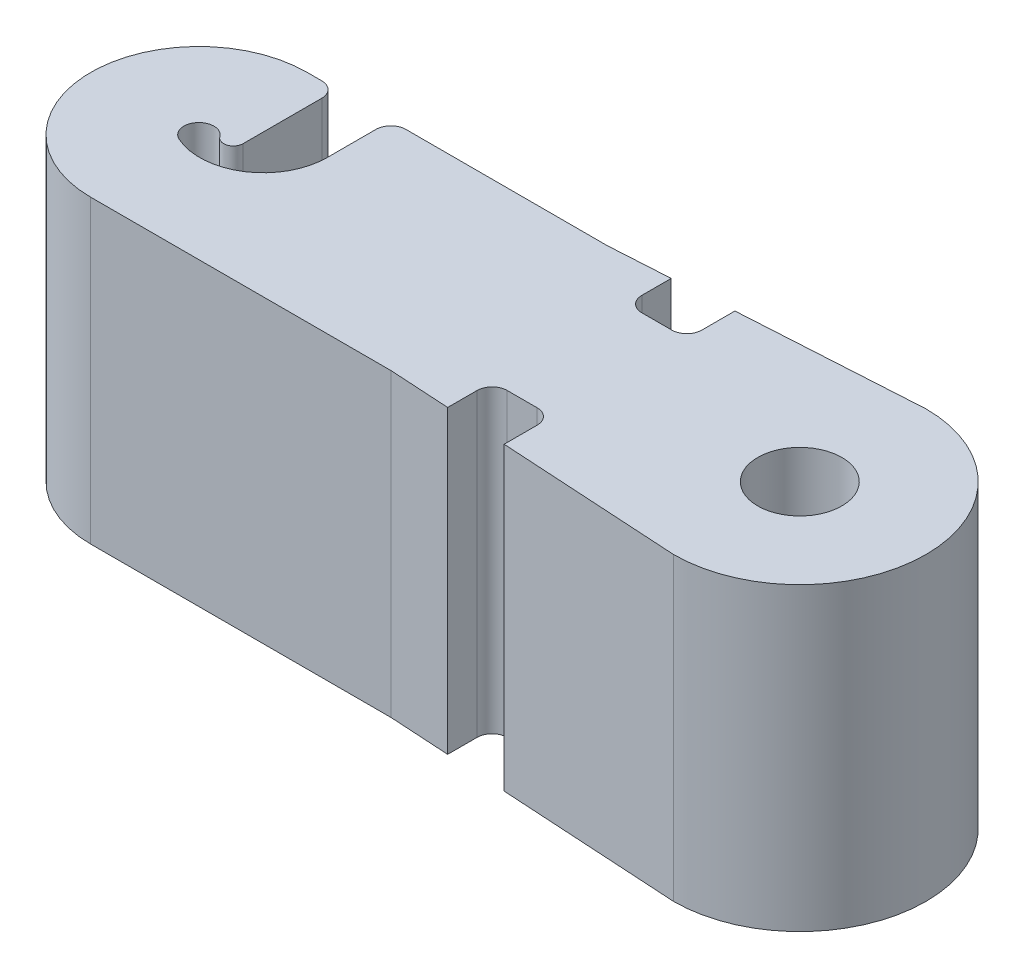
ISO-10303-21;
HEADER;
FILE_DESCRIPTION(('STEP AP214'),'2;1');
FILE_NAME('part.step','',(''),(''),'','','');
FILE_SCHEMA(('AUTOMOTIVE_DESIGN { 1 0 10303 214 1 1 1 1 }'));
ENDSEC;
DATA;
#1=APPLICATION_CONTEXT('core data for automotive mechanical design processes');
#2=APPLICATION_PROTOCOL_DEFINITION('international standard','automotive_design',2000,#1);
#3=PRODUCT_CONTEXT('',#1,'mechanical');
#4=PRODUCT('Part','Part','',(#3));
#5=PRODUCT_RELATED_PRODUCT_CATEGORY('part','',(#4));
#6=PRODUCT_DEFINITION_FORMATION('','',#4);
#7=PRODUCT_DEFINITION_CONTEXT('part definition',#1,'design');
#8=PRODUCT_DEFINITION('design','',#6,#7);
#9=PRODUCT_DEFINITION_SHAPE('','',#8);
#10=(LENGTH_UNIT() NAMED_UNIT(*) SI_UNIT(.MILLI.,.METRE.));
#11=(NAMED_UNIT(*) PLANE_ANGLE_UNIT() SI_UNIT($,.RADIAN.));
#12=(NAMED_UNIT(*) SI_UNIT($,.STERADIAN.) SOLID_ANGLE_UNIT());
#13=UNCERTAINTY_MEASURE_WITH_UNIT(LENGTH_MEASURE(1.E-05),#10,'distance_accuracy_value','');
#14=(GEOMETRIC_REPRESENTATION_CONTEXT(3) GLOBAL_UNCERTAINTY_ASSIGNED_CONTEXT((#13)) GLOBAL_UNIT_ASSIGNED_CONTEXT((#10,
#11,#12)) REPRESENTATION_CONTEXT('',''));
#15=CARTESIAN_POINT('',(0.,0.,0.));
#16=DIRECTION('',(0.,0.,1.));
#17=DIRECTION('',(1.,0.,0.));
#18=AXIS2_PLACEMENT_3D('',#15,#16,#17);
#19=CARTESIAN_POINT('',(-2.50000000000002,2.5,-0.9));
#20=DIRECTION('',(0.,0.,1.));
#21=DIRECTION('',(1.,0.,0.));
#22=AXIS2_PLACEMENT_3D('',#19,#20,#21);
#23=PLANE('',#22);
#24=DIRECTION('',(-1.,0.,0.));
#25=VECTOR('',#24,1.);
#26=CARTESIAN_POINT('',(-2.50000000000002,2.5,-0.9));
#27=LINE('',#26,#25);
#28=CARTESIAN_POINT('',(-4.87715394527874,2.5,-0.9));
#29=VERTEX_POINT('',#28);
#30=CARTESIAN_POINT('',(-5.,2.5,-0.9));
#31=VERTEX_POINT('',#30);
#32=EDGE_CURVE('E295',#29,#31,#27,.T.);
#33=ORIENTED_EDGE('',*,*,#32,.F.);
#34=DIRECTION('',(0.,1.,0.));
#35=VECTOR('',#34,1.);
#36=CARTESIAN_POINT('',(-4.87715394527874,2.5,-0.9));
#37=LINE('',#36,#35);
#38=CARTESIAN_POINT('',(-4.87715394527874,0.,-0.9));
#39=VERTEX_POINT('',#38);
#40=EDGE_CURVE('E368',#29,#39,#37,.F.);
#41=ORIENTED_EDGE('',*,*,#40,.T.);
#42=DIRECTION('',(-1.,0.,0.));
#43=VECTOR('',#42,1.);
#44=CARTESIAN_POINT('',(-2.50000000000002,0.,-0.9));
#45=LINE('',#44,#43);
#46=CARTESIAN_POINT('',(-5.,0.,-0.9));
#47=VERTEX_POINT('',#46);
#48=EDGE_CURVE('E336',#39,#47,#45,.T.);
#49=ORIENTED_EDGE('',*,*,#48,.T.);
#50=DIRECTION('',(0.,-1.,0.));
#51=VECTOR('',#50,1.);
#52=CARTESIAN_POINT('',(-5.,2.5,-0.9));
#53=LINE('',#52,#51);
#54=EDGE_CURVE('E342',#31,#47,#53,.T.);
#55=ORIENTED_EDGE('',*,*,#54,.F.);
#56=EDGE_LOOP('',(#33,#41,#49,#55));
#57=FACE_BOUND('',#56,.T.);
#58=ADVANCED_FACE('F35',(#57),#23,.F.);
#59=CARTESIAN_POINT('',(-2.50000000000002,2.5,-0.9));
#60=DIRECTION('',(-0.0598922907279451,0.,-0.998204845465779));
#61=DIRECTION('',(-0.998204845465779,0.,0.0598922907279451));
#62=AXIS2_PLACEMENT_3D('',#59,#60,#61);
#63=PLANE('',#62);
#64=DIRECTION('',(0.998204845465779,0.,-0.0598922907279451));
#65=VECTOR('',#64,1.);
#66=CARTESIAN_POINT('',(-2.50000000000002,0.,-0.9));
#67=LINE('',#66,#65);
#68=CARTESIAN_POINT('',(-2.50000000000002,0.,-0.9));
#69=VERTEX_POINT('',#68);
#70=CARTESIAN_POINT('',(-2.,0.,-0.93));
#71=VERTEX_POINT('',#70);
#72=EDGE_CURVE('E300',#69,#71,#67,.T.);
#73=ORIENTED_EDGE('',*,*,#72,.F.);
#74=DIRECTION('',(0.,-1.,0.));
#75=VECTOR('',#74,1.);
#76=CARTESIAN_POINT('',(-2.50000000000002,2.5,-0.9));
#77=LINE('',#76,#75);
#78=CARTESIAN_POINT('',(-2.50000000000002,2.5,-0.9));
#79=VERTEX_POINT('',#78);
#80=EDGE_CURVE('E339',#79,#69,#77,.T.);
#81=ORIENTED_EDGE('',*,*,#80,.F.);
#82=DIRECTION('',(0.998204845465779,0.,-0.0598922907279451));
#83=VECTOR('',#82,1.);
#84=CARTESIAN_POINT('',(-2.50000000000002,2.5,-0.9));
#85=LINE('',#84,#83);
#86=CARTESIAN_POINT('',(-2.,2.5,-0.93));
#87=VERTEX_POINT('',#86);
#88=EDGE_CURVE('E258',#79,#87,#85,.T.);
#89=ORIENTED_EDGE('',*,*,#88,.T.);
#90=DIRECTION('',(0.,-1.,0.));
#91=VECTOR('',#90,1.);
#92=CARTESIAN_POINT('',(-2.,2.5,-0.93));
#93=LINE('',#92,#91);
#94=EDGE_CURVE('E299',#87,#71,#93,.T.);
#95=ORIENTED_EDGE('',*,*,#94,.T.);
#96=EDGE_LOOP('',(#73,#81,#89,#95));
#97=FACE_BOUND('',#96,.T.);
#98=ADVANCED_FACE('F427',(#97),#63,.T.);
#99=CARTESIAN_POINT('',(-4.17715394527874,0.,-0.9));
#100=VERTEX_POINT('',#99);
#101=EDGE_CURVE('E262',#69,#100,#45,.T.);
#102=ORIENTED_EDGE('',*,*,#101,.T.);
#103=DIRECTION('',(0.,1.,0.));
#104=VECTOR('',#103,1.);
#105=CARTESIAN_POINT('',(-4.17715394527874,2.5,-0.9));
#106=LINE('',#105,#104);
#107=CARTESIAN_POINT('',(-4.17715394527874,2.5,-0.9));
#108=VERTEX_POINT('',#107);
#109=EDGE_CURVE('E374',#100,#108,#106,.T.);
#110=ORIENTED_EDGE('',*,*,#109,.T.);
#111=EDGE_CURVE('E296',#79,#108,#27,.T.);
#112=ORIENTED_EDGE('',*,*,#111,.F.);
#113=ORIENTED_EDGE('',*,*,#80,.T.);
#114=EDGE_LOOP('',(#102,#110,#112,#113));
#115=FACE_BOUND('',#114,.T.);
#116=ADVANCED_FACE('F431',(#115),#23,.F.);
#117=CARTESIAN_POINT('',(-5.,2.5,0.));
#118=DIRECTION('',(0.,-1.,0.));
#119=DIRECTION('',(0.,0.,-1.));
#120=AXIS2_PLACEMENT_3D('',#117,#118,#119);
#121=CYLINDRICAL_SURFACE('',#120,0.9);
#122=CARTESIAN_POINT('',(-5.,0.,0.));
#123=DIRECTION('',(0.,1.,0.));
#124=DIRECTION('',(0.,0.,1.));
#125=AXIS2_PLACEMENT_3D('',#122,#123,#124);
#126=CIRCLE('',#125,0.9);
#127=CARTESIAN_POINT('',(-5.,0.,0.9));
#128=VERTEX_POINT('',#127);
#129=EDGE_CURVE('E333',#47,#128,#126,.T.);
#130=ORIENTED_EDGE('',*,*,#129,.T.);
#131=DIRECTION('',(0.,-1.,0.));
#132=VECTOR('',#131,1.);
#133=CARTESIAN_POINT('',(-5.,2.5,0.9));
#134=LINE('',#133,#132);
#135=CARTESIAN_POINT('',(-5.,2.5,0.9));
#136=VERTEX_POINT('',#135);
#137=EDGE_CURVE('E345',#136,#128,#134,.T.);
#138=ORIENTED_EDGE('',*,*,#137,.F.);
#139=CARTESIAN_POINT('',(-5.,2.5,0.));
#140=DIRECTION('',(0.,1.,0.));
#141=DIRECTION('',(0.,0.,1.));
#142=AXIS2_PLACEMENT_3D('',#139,#140,#141);
#143=CIRCLE('',#142,0.9);
#144=EDGE_CURVE('E293',#31,#136,#143,.T.);
#145=ORIENTED_EDGE('',*,*,#144,.F.);
#146=ORIENTED_EDGE('',*,*,#54,.T.);
#147=EDGE_LOOP('',(#130,#138,#145,#146));
#148=FACE_BOUND('',#147,.T.);
#149=ADVANCED_FACE('F459',(#148),#121,.T.);
#150=CARTESIAN_POINT('',(-2.50000000000002,2.5,0.9));
#151=DIRECTION('',(0.,0.,1.));
#152=DIRECTION('',(1.,0.,0.));
#153=AXIS2_PLACEMENT_3D('',#150,#151,#152);
#154=PLANE('',#153);
#155=DIRECTION('',(-1.,0.,0.));
#156=VECTOR('',#155,1.);
#157=CARTESIAN_POINT('',(-2.50000000000002,0.,0.9));
#158=LINE('',#157,#156);
#159=CARTESIAN_POINT('',(-2.50000000000002,0.,0.9));
#160=VERTEX_POINT('',#159);
#161=EDGE_CURVE('E330',#160,#128,#158,.T.);
#162=ORIENTED_EDGE('',*,*,#161,.F.);
#163=DIRECTION('',(0.,-1.,0.));
#164=VECTOR('',#163,1.);
#165=CARTESIAN_POINT('',(-2.50000000000002,2.5,0.9));
#166=LINE('',#165,#164);
#167=CARTESIAN_POINT('',(-2.50000000000002,2.5,0.9));
#168=VERTEX_POINT('',#167);
#169=EDGE_CURVE('E347',#168,#160,#166,.T.);
#170=ORIENTED_EDGE('',*,*,#169,.F.);
#171=DIRECTION('',(-1.,0.,0.));
#172=VECTOR('',#171,1.);
#173=CARTESIAN_POINT('',(-2.50000000000002,2.5,0.9));
#174=LINE('',#173,#172);
#175=EDGE_CURVE('E290',#168,#136,#174,.T.);
#176=ORIENTED_EDGE('',*,*,#175,.T.);
#177=ORIENTED_EDGE('',*,*,#137,.T.);
#178=EDGE_LOOP('',(#162,#170,#176,#177));
#179=FACE_BOUND('',#178,.T.);
#180=ADVANCED_FACE('F465',(#179),#154,.T.);
#181=CARTESIAN_POINT('',(-2.50000000000002,2.5,0.9));
#182=DIRECTION('',(0.0598922907279451,0.,-0.998204845465779));
#183=DIRECTION('',(-0.998204845465779,0.,-0.0598922907279451));
#184=AXIS2_PLACEMENT_3D('',#181,#182,#183);
#185=PLANE('',#184);
#186=DIRECTION('',(0.998204845465779,0.,0.0598922907279451));
#187=VECTOR('',#186,1.);
#188=CARTESIAN_POINT('',(-2.50000000000002,0.,0.9));
#189=LINE('',#188,#187);
#190=CARTESIAN_POINT('',(-2.,0.,0.93));
#191=VERTEX_POINT('',#190);
#192=EDGE_CURVE('E328',#160,#191,#189,.T.);
#193=ORIENTED_EDGE('',*,*,#192,.T.);
#194=DIRECTION('',(0.,-1.,0.));
#195=VECTOR('',#194,1.);
#196=CARTESIAN_POINT('',(-2.,2.5,0.93));
#197=LINE('',#196,#195);
#198=CARTESIAN_POINT('',(-2.,2.5,0.93));
#199=VERTEX_POINT('',#198);
#200=EDGE_CURVE('E349',#199,#191,#197,.T.);
#201=ORIENTED_EDGE('',*,*,#200,.F.);
#202=DIRECTION('',(0.998204845465779,0.,0.0598922907279451));
#203=VECTOR('',#202,1.);
#204=CARTESIAN_POINT('',(-2.50000000000002,2.5,0.9));
#205=LINE('',#204,#203);
#206=EDGE_CURVE('E288',#168,#199,#205,.T.);
#207=ORIENTED_EDGE('',*,*,#206,.F.);
#208=ORIENTED_EDGE('',*,*,#169,.T.);
#209=EDGE_LOOP('',(#193,#201,#207,#208));
#210=FACE_BOUND('',#209,.T.);
#211=ADVANCED_FACE('F468',(#210),#185,.F.);
#212=CARTESIAN_POINT('',(-2.,2.5,0.93));
#213=DIRECTION('',(-1.,0.,0.));
#214=DIRECTION('',(0.,0.,1.));
#215=AXIS2_PLACEMENT_3D('',#212,#213,#214);
#216=PLANE('',#215);
#217=DIRECTION('',(0.,0.,-1.));
#218=VECTOR('',#217,1.);
#219=CARTESIAN_POINT('',(-2.,0.,0.93));
#220=LINE('',#219,#218);
#221=CARTESIAN_POINT('',(-2.,0.,0.685));
#222=VERTEX_POINT('',#221);
#223=EDGE_CURVE('E326',#191,#222,#220,.T.);
#224=ORIENTED_EDGE('',*,*,#223,.T.);
#225=DIRECTION('',(0.,-1.,0.));
#226=VECTOR('',#225,1.);
#227=CARTESIAN_POINT('',(-2.,2.5,0.685));
#228=LINE('',#227,#226);
#229=CARTESIAN_POINT('',(-2.,2.5,0.685));
#230=VERTEX_POINT('',#229);
#231=EDGE_CURVE('E383',#222,#230,#228,.F.);
#232=ORIENTED_EDGE('',*,*,#231,.T.);
#233=DIRECTION('',(0.,0.,-1.));
#234=VECTOR('',#233,1.);
#235=CARTESIAN_POINT('',(-2.,2.5,0.93));
#236=LINE('',#235,#234);
#237=EDGE_CURVE('E285',#199,#230,#236,.T.);
#238=ORIENTED_EDGE('',*,*,#237,.F.);
#239=ORIENTED_EDGE('',*,*,#200,.T.);
#240=EDGE_LOOP('',(#224,#232,#238,#239));
#241=FACE_BOUND('',#240,.T.);
#242=ADVANCED_FACE('F471',(#241),#216,.F.);
#243=CARTESIAN_POINT('',(-1.5,2.5,0.56));
#244=DIRECTION('',(0.,0.,1.));
#245=DIRECTION('',(1.,0.,0.));
#246=AXIS2_PLACEMENT_3D('',#243,#244,#245);
#247=PLANE('',#246);
#248=DIRECTION('',(-1.,0.,0.));
#249=VECTOR('',#248,1.);
#250=CARTESIAN_POINT('',(-1.5,2.5,0.56));
#251=LINE('',#250,#249);
#252=CARTESIAN_POINT('',(-1.625,2.5,0.56));
#253=VERTEX_POINT('',#252);
#254=CARTESIAN_POINT('',(-1.875,2.5,0.56));
#255=VERTEX_POINT('',#254);
#256=EDGE_CURVE('E282',#253,#255,#251,.T.);
#257=ORIENTED_EDGE('',*,*,#256,.T.);
#258=DIRECTION('',(0.,-1.,0.));
#259=VECTOR('',#258,1.);
#260=CARTESIAN_POINT('',(-1.875,2.5,0.56));
#261=LINE('',#260,#259);
#262=CARTESIAN_POINT('',(-1.875,0.,0.56));
#263=VERTEX_POINT('',#262);
#264=EDGE_CURVE('E381',#255,#263,#261,.T.);
#265=ORIENTED_EDGE('',*,*,#264,.T.);
#266=DIRECTION('',(-1.,0.,0.));
#267=VECTOR('',#266,1.);
#268=CARTESIAN_POINT('',(-1.5,0.,0.56));
#269=LINE('',#268,#267);
#270=CARTESIAN_POINT('',(-1.625,0.,0.56));
#271=VERTEX_POINT('',#270);
#272=EDGE_CURVE('E324',#271,#263,#269,.T.);
#273=ORIENTED_EDGE('',*,*,#272,.F.);
#274=DIRECTION('',(0.,-1.,0.));
#275=VECTOR('',#274,1.);
#276=CARTESIAN_POINT('',(-1.625,2.5,0.56));
#277=LINE('',#276,#275);
#278=EDGE_CURVE('E379',#271,#253,#277,.F.);
#279=ORIENTED_EDGE('',*,*,#278,.T.);
#280=EDGE_LOOP('',(#257,#265,#273,#279));
#281=FACE_BOUND('',#280,.T.);
#282=ADVANCED_FACE('F477',(#281),#247,.T.);
#283=CARTESIAN_POINT('',(-1.5,2.5,0.56));
#284=DIRECTION('',(1.,0.,0.));
#285=DIRECTION('',(0.,0.,-1.));
#286=AXIS2_PLACEMENT_3D('',#283,#284,#285);
#287=PLANE('',#286);
#288=DIRECTION('',(0.,0.,1.));
#289=VECTOR('',#288,1.);
#290=CARTESIAN_POINT('',(-1.5,2.5,0.56));
#291=LINE('',#290,#289);
#292=CARTESIAN_POINT('',(-1.5,2.5,0.685));
#293=VERTEX_POINT('',#292);
#294=CARTESIAN_POINT('',(-1.5,2.5,0.96));
#295=VERTEX_POINT('',#294);
#296=EDGE_CURVE('E280',#293,#295,#291,.T.);
#297=ORIENTED_EDGE('',*,*,#296,.F.);
#298=DIRECTION('',(0.,-1.,0.));
#299=VECTOR('',#298,1.);
#300=CARTESIAN_POINT('',(-1.5,2.5,0.685));
#301=LINE('',#300,#299);
#302=CARTESIAN_POINT('',(-1.5,0.,0.685));
#303=VERTEX_POINT('',#302);
#304=EDGE_CURVE('E385',#293,#303,#301,.T.);
#305=ORIENTED_EDGE('',*,*,#304,.T.);
#306=DIRECTION('',(0.,0.,1.));
#307=VECTOR('',#306,1.);
#308=CARTESIAN_POINT('',(-1.5,0.,0.56));
#309=LINE('',#308,#307);
#310=CARTESIAN_POINT('',(-1.5,0.,0.96));
#311=VERTEX_POINT('',#310);
#312=EDGE_CURVE('E322',#303,#311,#309,.T.);
#313=ORIENTED_EDGE('',*,*,#312,.T.);
#314=DIRECTION('',(0.,-1.,0.));
#315=VECTOR('',#314,1.);
#316=CARTESIAN_POINT('',(-1.5,2.5,0.96));
#317=LINE('',#316,#315);
#318=EDGE_CURVE('E352',#295,#311,#317,.T.);
#319=ORIENTED_EDGE('',*,*,#318,.F.);
#320=EDGE_LOOP('',(#297,#305,#313,#319));
#321=FACE_BOUND('',#320,.T.);
#322=ADVANCED_FACE('F486',(#321),#287,.F.);
#323=CARTESIAN_POINT('',(0.,2.5,1.05));
#324=DIRECTION('',(-0.0598922907279466,0.,0.998204845465779));
#325=DIRECTION('',(0.998204845465779,0.,0.0598922907279466));
#326=AXIS2_PLACEMENT_3D('',#323,#324,#325);
#327=PLANE('',#326);
#328=DIRECTION('',(-0.998204845465779,0.,-0.0598922907279466));
#329=VECTOR('',#328,1.);
#330=CARTESIAN_POINT('',(0.,0.,1.05));
#331=LINE('',#330,#329);
#332=CARTESIAN_POINT('',(0.,0.,1.05));
#333=VERTEX_POINT('',#332);
#334=EDGE_CURVE('E319',#333,#311,#331,.T.);
#335=ORIENTED_EDGE('',*,*,#334,.F.);
#336=DIRECTION('',(0.,-1.,0.));
#337=VECTOR('',#336,1.);
#338=CARTESIAN_POINT('',(0.,2.5,1.05));
#339=LINE('',#338,#337);
#340=CARTESIAN_POINT('',(0.,2.5,1.05));
#341=VERTEX_POINT('',#340);
#342=EDGE_CURVE('E355',#341,#333,#339,.T.);
#343=ORIENTED_EDGE('',*,*,#342,.F.);
#344=DIRECTION('',(-0.998204845465779,0.,-0.0598922907279466));
#345=VECTOR('',#344,1.);
#346=CARTESIAN_POINT('',(0.,2.5,1.05));
#347=LINE('',#346,#345);
#348=EDGE_CURVE('E277',#341,#295,#347,.T.);
#349=ORIENTED_EDGE('',*,*,#348,.T.);
#350=ORIENTED_EDGE('',*,*,#318,.T.);
#351=EDGE_LOOP('',(#335,#343,#349,#350));
#352=FACE_BOUND('',#351,.T.);
#353=ADVANCED_FACE('F540',(#352),#327,.T.);
#354=CARTESIAN_POINT('',(0.,2.5,0.));
#355=DIRECTION('',(0.,-1.,0.));
#356=DIRECTION('',(0.,0.,-1.));
#357=AXIS2_PLACEMENT_3D('',#354,#355,#356);
#358=CYLINDRICAL_SURFACE('',#357,1.05);
#359=CARTESIAN_POINT('',(0.,0.,0.));
#360=DIRECTION('',(0.,-1.,0.));
#361=DIRECTION('',(0.,0.,-1.));
#362=AXIS2_PLACEMENT_3D('',#359,#360,#361);
#363=CIRCLE('',#362,1.05);
#364=CARTESIAN_POINT('',(0.,0.,-1.05));
#365=VERTEX_POINT('',#364);
#366=EDGE_CURVE('E316',#365,#333,#363,.T.);
#367=ORIENTED_EDGE('',*,*,#366,.F.);
#368=DIRECTION('',(0.,-1.,0.));
#369=VECTOR('',#368,1.);
#370=CARTESIAN_POINT('',(0.,2.5,-1.05));
#371=LINE('',#370,#369);
#372=CARTESIAN_POINT('',(0.,2.5,-1.05));
#373=VERTEX_POINT('',#372);
#374=EDGE_CURVE('E357',#373,#365,#371,.T.);
#375=ORIENTED_EDGE('',*,*,#374,.F.);
#376=CARTESIAN_POINT('',(0.,2.5,0.));
#377=DIRECTION('',(0.,-1.,0.));
#378=DIRECTION('',(0.,0.,-1.));
#379=AXIS2_PLACEMENT_3D('',#376,#377,#378);
#380=CIRCLE('',#379,1.05);
#381=EDGE_CURVE('E274',#373,#341,#380,.T.);
#382=ORIENTED_EDGE('',*,*,#381,.T.);
#383=ORIENTED_EDGE('',*,*,#342,.T.);
#384=EDGE_LOOP('',(#367,#375,#382,#383));
#385=FACE_BOUND('',#384,.T.);
#386=ADVANCED_FACE('F494',(#385),#358,.T.);
#387=CARTESIAN_POINT('',(-1.5,2.5,-0.96));
#388=DIRECTION('',(-0.0598922907279466,0.,-0.998204845465779));
#389=DIRECTION('',(-0.998204845465779,0.,0.0598922907279466));
#390=AXIS2_PLACEMENT_3D('',#387,#388,#389);
#391=PLANE('',#390);
#392=DIRECTION('',(0.998204845465779,0.,-0.0598922907279466));
#393=VECTOR('',#392,1.);
#394=CARTESIAN_POINT('',(-1.5,0.,-0.96));
#395=LINE('',#394,#393);
#396=CARTESIAN_POINT('',(-1.5,0.,-0.96));
#397=VERTEX_POINT('',#396);
#398=EDGE_CURVE('E313',#397,#365,#395,.T.);
#399=ORIENTED_EDGE('',*,*,#398,.F.);
#400=DIRECTION('',(0.,-1.,0.));
#401=VECTOR('',#400,1.);
#402=CARTESIAN_POINT('',(-1.5,2.5,-0.96));
#403=LINE('',#402,#401);
#404=CARTESIAN_POINT('',(-1.5,2.5,-0.96));
#405=VERTEX_POINT('',#404);
#406=EDGE_CURVE('E359',#405,#397,#403,.T.);
#407=ORIENTED_EDGE('',*,*,#406,.F.);
#408=DIRECTION('',(0.998204845465779,0.,-0.0598922907279466));
#409=VECTOR('',#408,1.);
#410=CARTESIAN_POINT('',(-1.5,2.5,-0.96));
#411=LINE('',#410,#409);
#412=EDGE_CURVE('E271',#405,#373,#411,.T.);
#413=ORIENTED_EDGE('',*,*,#412,.T.);
#414=ORIENTED_EDGE('',*,*,#374,.T.);
#415=EDGE_LOOP('',(#399,#407,#413,#414));
#416=FACE_BOUND('',#415,.T.);
#417=ADVANCED_FACE('F498',(#416),#391,.T.);
#418=CARTESIAN_POINT('',(-1.5,2.5,-0.96));
#419=DIRECTION('',(1.,0.,0.));
#420=DIRECTION('',(0.,0.,-1.));
#421=AXIS2_PLACEMENT_3D('',#418,#419,#420);
#422=PLANE('',#421);
#423=DIRECTION('',(0.,0.,1.));
#424=VECTOR('',#423,1.);
#425=CARTESIAN_POINT('',(-1.5,0.,-0.96));
#426=LINE('',#425,#424);
#427=CARTESIAN_POINT('',(-1.5,0.,-0.685));
#428=VERTEX_POINT('',#427);
#429=EDGE_CURVE('E310',#397,#428,#426,.T.);
#430=ORIENTED_EDGE('',*,*,#429,.T.);
#431=DIRECTION('',(0.,-1.,0.));
#432=VECTOR('',#431,1.);
#433=CARTESIAN_POINT('',(-1.5,2.5,-0.685));
#434=LINE('',#433,#432);
#435=CARTESIAN_POINT('',(-1.5,2.5,-0.685));
#436=VERTEX_POINT('',#435);
#437=EDGE_CURVE('E393',#428,#436,#434,.F.);
#438=ORIENTED_EDGE('',*,*,#437,.T.);
#439=DIRECTION('',(0.,0.,1.));
#440=VECTOR('',#439,1.);
#441=CARTESIAN_POINT('',(-1.5,2.5,-0.96));
#442=LINE('',#441,#440);
#443=EDGE_CURVE('E268',#405,#436,#442,.T.);
#444=ORIENTED_EDGE('',*,*,#443,.F.);
#445=ORIENTED_EDGE('',*,*,#406,.T.);
#446=EDGE_LOOP('',(#430,#438,#444,#445));
#447=FACE_BOUND('',#446,.T.);
#448=ADVANCED_FACE('F506',(#447),#422,.F.);
#449=CARTESIAN_POINT('',(-2.,2.5,-0.56));
#450=DIRECTION('',(0.,0.,-1.));
#451=DIRECTION('',(-1.,0.,0.));
#452=AXIS2_PLACEMENT_3D('',#449,#450,#451);
#453=PLANE('',#452);
#454=DIRECTION('',(1.,0.,0.));
#455=VECTOR('',#454,1.);
#456=CARTESIAN_POINT('',(-2.,2.5,-0.56));
#457=LINE('',#456,#455);
#458=CARTESIAN_POINT('',(-1.875,2.5,-0.56));
#459=VERTEX_POINT('',#458);
#460=CARTESIAN_POINT('',(-1.625,2.5,-0.56));
#461=VERTEX_POINT('',#460);
#462=EDGE_CURVE('E265',#459,#461,#457,.T.);
#463=ORIENTED_EDGE('',*,*,#462,.T.);
#464=DIRECTION('',(0.,-1.,0.));
#465=VECTOR('',#464,1.);
#466=CARTESIAN_POINT('',(-1.625,2.5,-0.56));
#467=LINE('',#466,#465);
#468=CARTESIAN_POINT('',(-1.625,0.,-0.56));
#469=VERTEX_POINT('',#468);
#470=EDGE_CURVE('E390',#461,#469,#467,.T.);
#471=ORIENTED_EDGE('',*,*,#470,.T.);
#472=DIRECTION('',(1.,0.,0.));
#473=VECTOR('',#472,1.);
#474=CARTESIAN_POINT('',(-2.,0.,-0.56));
#475=LINE('',#474,#473);
#476=CARTESIAN_POINT('',(-1.875,0.,-0.56));
#477=VERTEX_POINT('',#476);
#478=EDGE_CURVE('E307',#477,#469,#475,.T.);
#479=ORIENTED_EDGE('',*,*,#478,.F.);
#480=DIRECTION('',(0.,-1.,0.));
#481=VECTOR('',#480,1.);
#482=CARTESIAN_POINT('',(-1.875,2.5,-0.56));
#483=LINE('',#482,#481);
#484=EDGE_CURVE('E388',#477,#459,#483,.F.);
#485=ORIENTED_EDGE('',*,*,#484,.T.);
#486=EDGE_LOOP('',(#463,#471,#479,#485));
#487=FACE_BOUND('',#486,.T.);
#488=ADVANCED_FACE('F414',(#487),#453,.T.);
#489=CARTESIAN_POINT('',(-2.,2.5,-0.93));
#490=DIRECTION('',(1.,0.,0.));
#491=DIRECTION('',(0.,0.,-1.));
#492=AXIS2_PLACEMENT_3D('',#489,#490,#491);
#493=PLANE('',#492);
#494=DIRECTION('',(0.,0.,1.));
#495=VECTOR('',#494,1.);
#496=CARTESIAN_POINT('',(-2.,2.5,-0.93));
#497=LINE('',#496,#495);
#498=CARTESIAN_POINT('',(-2.,2.5,-0.685));
#499=VERTEX_POINT('',#498);
#500=EDGE_CURVE('E261',#87,#499,#497,.T.);
#501=ORIENTED_EDGE('',*,*,#500,.T.);
#502=DIRECTION('',(0.,-1.,0.));
#503=VECTOR('',#502,1.);
#504=CARTESIAN_POINT('',(-2.,0.,-0.685));
#505=LINE('',#504,#503);
#506=CARTESIAN_POINT('',(-2.,0.,-0.685));
#507=VERTEX_POINT('',#506);
#508=EDGE_CURVE('E395',#499,#507,#505,.T.);
#509=ORIENTED_EDGE('',*,*,#508,.T.);
#510=DIRECTION('',(0.,0.,1.));
#511=VECTOR('',#510,1.);
#512=CARTESIAN_POINT('',(-2.,0.,-0.93));
#513=LINE('',#512,#511);
#514=EDGE_CURVE('E303',#71,#507,#513,.T.);
#515=ORIENTED_EDGE('',*,*,#514,.F.);
#516=ORIENTED_EDGE('',*,*,#94,.F.);
#517=EDGE_LOOP('',(#501,#509,#515,#516));
#518=FACE_BOUND('',#517,.T.);
#519=ADVANCED_FACE('F424',(#518),#493,.T.);
#520=CARTESIAN_POINT('',(0.,2.5,0.));
#521=DIRECTION('',(0.,-1.,0.));
#522=DIRECTION('',(0.,0.,-1.));
#523=AXIS2_PLACEMENT_3D('',#520,#521,#522);
#524=PLANE('',#523);
#525=CARTESIAN_POINT('',(0.,2.5,0.));
#526=DIRECTION('',(0.,1.,0.));
#527=DIRECTION('',(0.,0.,1.));
#528=AXIS2_PLACEMENT_3D('',#525,#526,#527);
#529=CIRCLE('',#528,0.35);
#530=CARTESIAN_POINT('',(0.,2.5,0.35));
#531=VERTEX_POINT('',#530);
#532=EDGE_CURVE('E238',#531,#531,#529,.T.);
#533=ORIENTED_EDGE('',*,*,#532,.F.);
#534=EDGE_LOOP('',(#533));
#535=FACE_BOUND('',#534,.T.);
#536=DIRECTION('',(0.,0.,1.));
#537=VECTOR('',#536,1.);
#538=CARTESIAN_POINT('',(-4.75215394527874,2.5,-0.9));
#539=LINE('',#538,#537);
#540=CARTESIAN_POINT('',(-4.75215394527874,2.5,-0.775));
#541=VERTEX_POINT('',#540);
#542=CARTESIAN_POINT('',(-4.75215394527874,2.5,-0.119444444444444));
#543=VERTEX_POINT('',#542);
#544=EDGE_CURVE('E235',#541,#543,#539,.T.);
#545=ORIENTED_EDGE('',*,*,#544,.F.);
#546=CARTESIAN_POINT('',(-4.87715394527874,2.5,-0.775));
#547=DIRECTION('',(0.,-1.,0.));
#548=DIRECTION('',(0.,0.,-1.));
#549=AXIS2_PLACEMENT_3D('',#546,#547,#548);
#550=CIRCLE('',#549,0.125);
#551=EDGE_CURVE('E366',#541,#29,#550,.F.);
#552=ORIENTED_EDGE('',*,*,#551,.T.);
#553=ORIENTED_EDGE('',*,*,#32,.T.);
#554=ORIENTED_EDGE('',*,*,#144,.T.);
#555=ORIENTED_EDGE('',*,*,#175,.F.);
#556=ORIENTED_EDGE('',*,*,#206,.T.);
#557=ORIENTED_EDGE('',*,*,#237,.T.);
#558=CARTESIAN_POINT('',(-1.875,2.5,0.685));
#559=DIRECTION('',(0.,-1.,0.));
#560=DIRECTION('',(0.,0.,-1.));
#561=AXIS2_PLACEMENT_3D('',#558,#559,#560);
#562=CIRCLE('',#561,0.125);
#563=EDGE_CURVE('E399',#230,#255,#562,.T.);
#564=ORIENTED_EDGE('',*,*,#563,.T.);
#565=ORIENTED_EDGE('',*,*,#256,.F.);
#566=CARTESIAN_POINT('',(-1.625,2.5,0.685));
#567=DIRECTION('',(0.,-1.,0.));
#568=DIRECTION('',(0.,0.,-1.));
#569=AXIS2_PLACEMENT_3D('',#566,#567,#568);
#570=CIRCLE('',#569,0.125);
#571=EDGE_CURVE('E403',#253,#293,#570,.T.);
#572=ORIENTED_EDGE('',*,*,#571,.T.);
#573=ORIENTED_EDGE('',*,*,#296,.T.);
#574=ORIENTED_EDGE('',*,*,#348,.F.);
#575=ORIENTED_EDGE('',*,*,#381,.F.);
#576=ORIENTED_EDGE('',*,*,#412,.F.);
#577=ORIENTED_EDGE('',*,*,#443,.T.);
#578=CARTESIAN_POINT('',(-1.625,2.5,-0.685));
#579=DIRECTION('',(0.,-1.,0.));
#580=DIRECTION('',(0.,0.,-1.));
#581=AXIS2_PLACEMENT_3D('',#578,#579,#580);
#582=CIRCLE('',#581,0.125);
#583=EDGE_CURVE('E407',#436,#461,#582,.T.);
#584=ORIENTED_EDGE('',*,*,#583,.T.);
#585=ORIENTED_EDGE('',*,*,#462,.F.);
#586=CARTESIAN_POINT('',(-1.875,2.5,-0.685));
#587=DIRECTION('',(0.,-1.,0.));
#588=DIRECTION('',(0.,0.,-1.));
#589=AXIS2_PLACEMENT_3D('',#586,#587,#588);
#590=CIRCLE('',#589,0.125);
#591=EDGE_CURVE('E11',#459,#499,#590,.T.);
#592=ORIENTED_EDGE('',*,*,#591,.T.);
#593=ORIENTED_EDGE('',*,*,#500,.F.);
#594=ORIENTED_EDGE('',*,*,#88,.F.);
#595=ORIENTED_EDGE('',*,*,#111,.T.);
#596=CARTESIAN_POINT('',(-4.17715394527874,2.5,-0.775));
#597=DIRECTION('',(0.,-1.,0.));
#598=DIRECTION('',(0.,0.,-1.));
#599=AXIS2_PLACEMENT_3D('',#596,#597,#598);
#600=CIRCLE('',#599,0.125);
#601=CARTESIAN_POINT('',(-4.30215394527874,2.5,-0.775));
#602=VERTEX_POINT('',#601);
#603=EDGE_CURVE('E364',#108,#602,#600,.F.);
#604=ORIENTED_EDGE('',*,*,#603,.T.);
#605=DIRECTION('',(0.,0.,-1.));
#606=VECTOR('',#605,1.);
#607=CARTESIAN_POINT('',(-4.30215394527874,2.5,-0.9));
#608=LINE('',#607,#606);
#609=CARTESIAN_POINT('',(-4.30215394527874,2.5,-0.369444444444444));
#610=VERTEX_POINT('',#609);
#611=EDGE_CURVE('E248',#610,#602,#608,.T.);
#612=ORIENTED_EDGE('',*,*,#611,.F.);
#613=CARTESIAN_POINT('',(-4.83270950083429,2.5,-0.369444444444444));
#614=DIRECTION('',(0.,1.,0.));
#615=DIRECTION('',(0.,0.,1.));
#616=AXIS2_PLACEMENT_3D('',#613,#614,#615);
#617=CIRCLE('',#616,0.530555555555556);
#618=CARTESIAN_POINT('',(-5.05156214015381,2.5,0.113869863013699));
#619=VERTEX_POINT('',#618);
#620=EDGE_CURVE('E246',#619,#610,#617,.T.);
#621=ORIENTED_EDGE('',*,*,#620,.F.);
#622=CARTESIAN_POINT('',(-5.,2.5,0.));
#623=DIRECTION('',(0.,1.,0.));
#624=DIRECTION('',(0.,0.,1.));
#625=AXIS2_PLACEMENT_3D('',#622,#623,#624);
#626=CIRCLE('',#625,0.125);
#627=CARTESIAN_POINT('',(-4.89826929104788,2.5,-0.0726351351351351));
#628=VERTEX_POINT('',#627);
#629=EDGE_CURVE('E215',#628,#619,#626,.T.);
#630=ORIENTED_EDGE('',*,*,#629,.F.);
#631=CARTESIAN_POINT('',(-4.83270950083429,2.5,-0.119444444444444));
#632=DIRECTION('',(0.,-1.,0.));
#633=DIRECTION('',(0.,0.,-1.));
#634=AXIS2_PLACEMENT_3D('',#631,#632,#633);
#635=CIRCLE('',#634,0.0805555555555551);
#636=EDGE_CURVE('E232',#543,#628,#635,.T.);
#637=ORIENTED_EDGE('',*,*,#636,.F.);
#638=EDGE_LOOP('',(#545,#552,#553,#554,#555,#556,#557,#564,#565,#572,#573,#574,#575,#576,#577,
#584,#585,#592,#593,#594,#595,#604,#612,#621,#630,#637));
#639=FACE_BOUND('',#638,.T.);
#640=ADVANCED_FACE('F421',(#535,#639),#524,.F.);
#641=CARTESIAN_POINT('',(0.,0.,0.));
#642=DIRECTION('',(0.,-1.,0.));
#643=DIRECTION('',(0.,0.,-1.));
#644=AXIS2_PLACEMENT_3D('',#641,#642,#643);
#645=PLANE('',#644);
#646=CARTESIAN_POINT('',(0.,0.,0.));
#647=DIRECTION('',(0.,1.,0.));
#648=DIRECTION('',(0.,0.,1.));
#649=AXIS2_PLACEMENT_3D('',#646,#647,#648);
#650=CIRCLE('',#649,0.35);
#651=CARTESIAN_POINT('',(0.,0.,0.35));
#652=VERTEX_POINT('',#651);
#653=EDGE_CURVE('E304',#652,#652,#650,.T.);
#654=ORIENTED_EDGE('',*,*,#653,.T.);
#655=EDGE_LOOP('',(#654));
#656=FACE_BOUND('',#655,.T.);
#657=ORIENTED_EDGE('',*,*,#48,.F.);
#658=CARTESIAN_POINT('',(-4.87715394527874,0.,-0.775));
#659=DIRECTION('',(0.,-1.,0.));
#660=DIRECTION('',(0.,0.,-1.));
#661=AXIS2_PLACEMENT_3D('',#658,#659,#660);
#662=CIRCLE('',#661,0.125);
#663=CARTESIAN_POINT('',(-4.75215394527874,0.,-0.775));
#664=VERTEX_POINT('',#663);
#665=EDGE_CURVE('E372',#39,#664,#662,.T.);
#666=ORIENTED_EDGE('',*,*,#665,.T.);
#667=DIRECTION('',(0.,0.,1.));
#668=VECTOR('',#667,1.);
#669=CARTESIAN_POINT('',(-4.75215394527874,0.,-0.9));
#670=LINE('',#669,#668);
#671=CARTESIAN_POINT('',(-4.75215394527874,0.,-0.119444444444444));
#672=VERTEX_POINT('',#671);
#673=EDGE_CURVE('E242',#664,#672,#670,.T.);
#674=ORIENTED_EDGE('',*,*,#673,.T.);
#675=CARTESIAN_POINT('',(-4.83270950083429,0.,-0.119444444444444));
#676=DIRECTION('',(0.,-1.,0.));
#677=DIRECTION('',(0.,0.,-1.));
#678=AXIS2_PLACEMENT_3D('',#675,#676,#677);
#679=CIRCLE('',#678,0.0805555555555551);
#680=CARTESIAN_POINT('',(-4.89826929104788,0.,-0.0726351351351351));
#681=VERTEX_POINT('',#680);
#682=EDGE_CURVE('E220',#672,#681,#679,.T.);
#683=ORIENTED_EDGE('',*,*,#682,.T.);
#684=CARTESIAN_POINT('',(-5.,0.,0.));
#685=DIRECTION('',(0.,1.,0.));
#686=DIRECTION('',(0.,0.,1.));
#687=AXIS2_PLACEMENT_3D('',#684,#685,#686);
#688=CIRCLE('',#687,0.125);
#689=CARTESIAN_POINT('',(-5.05156214015381,0.,0.113869863013699));
#690=VERTEX_POINT('',#689);
#691=EDGE_CURVE('E212',#681,#690,#688,.T.);
#692=ORIENTED_EDGE('',*,*,#691,.T.);
#693=CARTESIAN_POINT('',(-4.83270950083429,0.,-0.369444444444444));
#694=DIRECTION('',(0.,1.,0.));
#695=DIRECTION('',(0.,0.,1.));
#696=AXIS2_PLACEMENT_3D('',#693,#694,#695);
#697=CIRCLE('',#696,0.530555555555556);
#698=CARTESIAN_POINT('',(-4.30215394527874,0.,-0.369444444444444));
#699=VERTEX_POINT('',#698);
#700=EDGE_CURVE('E224',#690,#699,#697,.T.);
#701=ORIENTED_EDGE('',*,*,#700,.T.);
#702=DIRECTION('',(0.,0.,-1.));
#703=VECTOR('',#702,1.);
#704=CARTESIAN_POINT('',(-4.30215394527874,0.,-0.9));
#705=LINE('',#704,#703);
#706=CARTESIAN_POINT('',(-4.30215394527874,0.,-0.775));
#707=VERTEX_POINT('',#706);
#708=EDGE_CURVE('E227',#699,#707,#705,.T.);
#709=ORIENTED_EDGE('',*,*,#708,.T.);
#710=CARTESIAN_POINT('',(-4.17715394527874,0.,-0.775));
#711=DIRECTION('',(0.,-1.,0.));
#712=DIRECTION('',(0.,0.,-1.));
#713=AXIS2_PLACEMENT_3D('',#710,#711,#712);
#714=CIRCLE('',#713,0.125);
#715=EDGE_CURVE('E370',#707,#100,#714,.T.);
#716=ORIENTED_EDGE('',*,*,#715,.T.);
#717=ORIENTED_EDGE('',*,*,#101,.F.);
#718=ORIENTED_EDGE('',*,*,#72,.T.);
#719=ORIENTED_EDGE('',*,*,#514,.T.);
#720=CARTESIAN_POINT('',(-1.875,0.,-0.685));
#721=DIRECTION('',(0.,-1.,0.));
#722=DIRECTION('',(0.,0.,-1.));
#723=AXIS2_PLACEMENT_3D('',#720,#721,#722);
#724=CIRCLE('',#723,0.125);
#725=EDGE_CURVE('E43',#507,#477,#724,.F.);
#726=ORIENTED_EDGE('',*,*,#725,.T.);
#727=ORIENTED_EDGE('',*,*,#478,.T.);
#728=CARTESIAN_POINT('',(-1.625,0.,-0.685));
#729=DIRECTION('',(0.,-1.,0.));
#730=DIRECTION('',(0.,0.,-1.));
#731=AXIS2_PLACEMENT_3D('',#728,#729,#730);
#732=CIRCLE('',#731,0.125);
#733=EDGE_CURVE('E405',#469,#428,#732,.F.);
#734=ORIENTED_EDGE('',*,*,#733,.T.);
#735=ORIENTED_EDGE('',*,*,#429,.F.);
#736=ORIENTED_EDGE('',*,*,#398,.T.);
#737=ORIENTED_EDGE('',*,*,#366,.T.);
#738=ORIENTED_EDGE('',*,*,#334,.T.);
#739=ORIENTED_EDGE('',*,*,#312,.F.);
#740=CARTESIAN_POINT('',(-1.625,0.,0.685));
#741=DIRECTION('',(0.,-1.,0.));
#742=DIRECTION('',(0.,0.,-1.));
#743=AXIS2_PLACEMENT_3D('',#740,#741,#742);
#744=CIRCLE('',#743,0.125);
#745=EDGE_CURVE('E401',#303,#271,#744,.F.);
#746=ORIENTED_EDGE('',*,*,#745,.T.);
#747=ORIENTED_EDGE('',*,*,#272,.T.);
#748=CARTESIAN_POINT('',(-1.875,0.,0.685));
#749=DIRECTION('',(0.,-1.,0.));
#750=DIRECTION('',(0.,0.,-1.));
#751=AXIS2_PLACEMENT_3D('',#748,#749,#750);
#752=CIRCLE('',#751,0.125);
#753=EDGE_CURVE('E50',#263,#222,#752,.F.);
#754=ORIENTED_EDGE('',*,*,#753,.T.);
#755=ORIENTED_EDGE('',*,*,#223,.F.);
#756=ORIENTED_EDGE('',*,*,#192,.F.);
#757=ORIENTED_EDGE('',*,*,#161,.T.);
#758=ORIENTED_EDGE('',*,*,#129,.F.);
#759=EDGE_LOOP('',(#657,#666,#674,#683,#692,#701,#709,#716,#717,#718,#719,#726,#727,#734,#735,
#736,#737,#738,#739,#746,#747,#754,#755,#756,#757,#758));
#760=FACE_BOUND('',#759,.T.);
#761=ADVANCED_FACE('F230',(#656,#760),#645,.T.);
#762=CARTESIAN_POINT('',(-5.,0.,0.));
#763=DIRECTION('',(0.,1.,0.));
#764=DIRECTION('',(0.,0.,1.));
#765=AXIS2_PLACEMENT_3D('',#762,#763,#764);
#766=CYLINDRICAL_SURFACE('',#765,0.125);
#767=ORIENTED_EDGE('',*,*,#629,.T.);
#768=DIRECTION('',(0.,1.,0.));
#769=VECTOR('',#768,1.);
#770=CARTESIAN_POINT('',(-5.05156214015381,0.,0.113869863013699));
#771=LINE('',#770,#769);
#772=EDGE_CURVE('E208',#690,#619,#771,.T.);
#773=ORIENTED_EDGE('',*,*,#772,.F.);
#774=ORIENTED_EDGE('',*,*,#691,.F.);
#775=DIRECTION('',(0.,1.,0.));
#776=VECTOR('',#775,1.);
#777=CARTESIAN_POINT('',(-4.89826929104788,0.,-0.0726351351351351));
#778=LINE('',#777,#776);
#779=EDGE_CURVE('E252',#681,#628,#778,.T.);
#780=ORIENTED_EDGE('',*,*,#779,.T.);
#781=EDGE_LOOP('',(#767,#773,#774,#780));
#782=FACE_BOUND('',#781,.T.);
#783=ADVANCED_FACE('F210',(#782),#766,.F.);
#784=CARTESIAN_POINT('',(-4.83270950083429,0.,-0.119444444444444));
#785=DIRECTION('',(0.,1.,0.));
#786=DIRECTION('',(0.,0.,1.));
#787=AXIS2_PLACEMENT_3D('',#784,#785,#786);
#788=CYLINDRICAL_SURFACE('',#787,0.0805555555555551);
#789=ORIENTED_EDGE('',*,*,#636,.T.);
#790=ORIENTED_EDGE('',*,*,#779,.F.);
#791=ORIENTED_EDGE('',*,*,#682,.F.);
#792=DIRECTION('',(0.,1.,0.));
#793=VECTOR('',#792,1.);
#794=CARTESIAN_POINT('',(-4.75215394527874,0.,-0.119444444444444));
#795=LINE('',#794,#793);
#796=EDGE_CURVE('E254',#672,#543,#795,.T.);
#797=ORIENTED_EDGE('',*,*,#796,.T.);
#798=EDGE_LOOP('',(#789,#790,#791,#797));
#799=FACE_BOUND('',#798,.T.);
#800=ADVANCED_FACE('F442',(#799),#788,.T.);
#801=CARTESIAN_POINT('',(-4.75215394527874,0.,-0.9));
#802=DIRECTION('',(-1.,0.,0.));
#803=DIRECTION('',(0.,0.,1.));
#804=AXIS2_PLACEMENT_3D('',#801,#802,#803);
#805=PLANE('',#804);
#806=ORIENTED_EDGE('',*,*,#673,.F.);
#807=DIRECTION('',(0.,1.,0.));
#808=VECTOR('',#807,1.);
#809=CARTESIAN_POINT('',(-4.75215394527874,0.,-0.775));
#810=LINE('',#809,#808);
#811=EDGE_CURVE('E341',#664,#541,#810,.T.);
#812=ORIENTED_EDGE('',*,*,#811,.T.);
#813=ORIENTED_EDGE('',*,*,#544,.T.);
#814=ORIENTED_EDGE('',*,*,#796,.F.);
#815=EDGE_LOOP('',(#806,#812,#813,#814));
#816=FACE_BOUND('',#815,.T.);
#817=ADVANCED_FACE('F446',(#816),#805,.F.);
#818=CARTESIAN_POINT('',(-4.30215394527874,0.,-0.9));
#819=DIRECTION('',(1.,0.,0.));
#820=DIRECTION('',(0.,0.,-1.));
#821=AXIS2_PLACEMENT_3D('',#818,#819,#820);
#822=PLANE('',#821);
#823=ORIENTED_EDGE('',*,*,#611,.T.);
#824=DIRECTION('',(0.,1.,0.));
#825=VECTOR('',#824,1.);
#826=CARTESIAN_POINT('',(-4.30215394527874,0.,-0.775));
#827=LINE('',#826,#825);
#828=EDGE_CURVE('E377',#602,#707,#827,.F.);
#829=ORIENTED_EDGE('',*,*,#828,.T.);
#830=ORIENTED_EDGE('',*,*,#708,.F.);
#831=DIRECTION('',(0.,1.,0.));
#832=VECTOR('',#831,1.);
#833=CARTESIAN_POINT('',(-4.30215394527874,0.,-0.369444444444444));
#834=LINE('',#833,#832);
#835=EDGE_CURVE('E219',#699,#610,#834,.T.);
#836=ORIENTED_EDGE('',*,*,#835,.T.);
#837=EDGE_LOOP('',(#823,#829,#830,#836));
#838=FACE_BOUND('',#837,.T.);
#839=ADVANCED_FACE('F439',(#838),#822,.F.);
#840=CARTESIAN_POINT('',(-4.83270950083429,0.,-0.369444444444444));
#841=DIRECTION('',(0.,1.,0.));
#842=DIRECTION('',(0.,0.,1.));
#843=AXIS2_PLACEMENT_3D('',#840,#841,#842);
#844=CYLINDRICAL_SURFACE('',#843,0.530555555555556);
#845=ORIENTED_EDGE('',*,*,#620,.T.);
#846=ORIENTED_EDGE('',*,*,#835,.F.);
#847=ORIENTED_EDGE('',*,*,#700,.F.);
#848=ORIENTED_EDGE('',*,*,#772,.T.);
#849=EDGE_LOOP('',(#845,#846,#847,#848));
#850=FACE_BOUND('',#849,.T.);
#851=ADVANCED_FACE('F225',(#850),#844,.F.);
#852=CARTESIAN_POINT('',(0.,0.,0.));
#853=DIRECTION('',(0.,1.,0.));
#854=DIRECTION('',(0.,0.,1.));
#855=AXIS2_PLACEMENT_3D('',#852,#853,#854);
#856=CYLINDRICAL_SURFACE('',#855,0.35);
#857=ORIENTED_EDGE('',*,*,#653,.F.);
#858=EDGE_LOOP('',(#857));
#859=FACE_BOUND('',#858,.T.);
#860=ORIENTED_EDGE('',*,*,#532,.T.);
#861=EDGE_LOOP('',(#860));
#862=FACE_BOUND('',#861,.T.);
#863=ADVANCED_FACE('F582',(#859,#862),#856,.F.);
#864=CARTESIAN_POINT('',(-4.87715394527874,0.,-0.775));
#865=DIRECTION('',(0.,1.,0.));
#866=DIRECTION('',(0.,0.,1.));
#867=AXIS2_PLACEMENT_3D('',#864,#865,#866);
#868=CYLINDRICAL_SURFACE('',#867,0.125);
#869=ORIENTED_EDGE('',*,*,#665,.F.);
#870=ORIENTED_EDGE('',*,*,#40,.F.);
#871=ORIENTED_EDGE('',*,*,#551,.F.);
#872=ORIENTED_EDGE('',*,*,#811,.F.);
#873=EDGE_LOOP('',(#869,#870,#871,#872));
#874=FACE_BOUND('',#873,.T.);
#875=ADVANCED_FACE('F450',(#874),#868,.T.);
#876=CARTESIAN_POINT('',(-4.17715394527874,2.5,-0.775));
#877=DIRECTION('',(0.,1.,0.));
#878=DIRECTION('',(0.,0.,1.));
#879=AXIS2_PLACEMENT_3D('',#876,#877,#878);
#880=CYLINDRICAL_SURFACE('',#879,0.125);
#881=ORIENTED_EDGE('',*,*,#715,.F.);
#882=ORIENTED_EDGE('',*,*,#828,.F.);
#883=ORIENTED_EDGE('',*,*,#603,.F.);
#884=ORIENTED_EDGE('',*,*,#109,.F.);
#885=EDGE_LOOP('',(#881,#882,#883,#884));
#886=FACE_BOUND('',#885,.T.);
#887=ADVANCED_FACE('F436',(#886),#880,.T.);
#888=CARTESIAN_POINT('',(-1.875,2.5,0.685));
#889=DIRECTION('',(0.,-1.,0.));
#890=DIRECTION('',(0.,0.,-1.));
#891=AXIS2_PLACEMENT_3D('',#888,#889,#890);
#892=CYLINDRICAL_SURFACE('',#891,0.125);
#893=ORIENTED_EDGE('',*,*,#563,.F.);
#894=ORIENTED_EDGE('',*,*,#231,.F.);
#895=ORIENTED_EDGE('',*,*,#753,.F.);
#896=ORIENTED_EDGE('',*,*,#264,.F.);
#897=EDGE_LOOP('',(#893,#894,#895,#896));
#898=FACE_BOUND('',#897,.T.);
#899=ADVANCED_FACE('F474',(#898),#892,.F.);
#900=CARTESIAN_POINT('',(-1.625,2.5,0.685));
#901=DIRECTION('',(0.,-1.,0.));
#902=DIRECTION('',(0.,0.,-1.));
#903=AXIS2_PLACEMENT_3D('',#900,#901,#902);
#904=CYLINDRICAL_SURFACE('',#903,0.125);
#905=ORIENTED_EDGE('',*,*,#571,.F.);
#906=ORIENTED_EDGE('',*,*,#278,.F.);
#907=ORIENTED_EDGE('',*,*,#745,.F.);
#908=ORIENTED_EDGE('',*,*,#304,.F.);
#909=EDGE_LOOP('',(#905,#906,#907,#908));
#910=FACE_BOUND('',#909,.T.);
#911=ADVANCED_FACE('F483',(#910),#904,.F.);
#912=CARTESIAN_POINT('',(-1.625,2.5,-0.685));
#913=DIRECTION('',(0.,-1.,0.));
#914=DIRECTION('',(0.,0.,-1.));
#915=AXIS2_PLACEMENT_3D('',#912,#913,#914);
#916=CYLINDRICAL_SURFACE('',#915,0.125);
#917=ORIENTED_EDGE('',*,*,#583,.F.);
#918=ORIENTED_EDGE('',*,*,#437,.F.);
#919=ORIENTED_EDGE('',*,*,#733,.F.);
#920=ORIENTED_EDGE('',*,*,#470,.F.);
#921=EDGE_LOOP('',(#917,#918,#919,#920));
#922=FACE_BOUND('',#921,.T.);
#923=ADVANCED_FACE('F504',(#922),#916,.F.);
#924=CARTESIAN_POINT('',(-1.875,2.5,-0.685));
#925=DIRECTION('',(0.,1.,0.));
#926=DIRECTION('',(0.,0.,1.));
#927=AXIS2_PLACEMENT_3D('',#924,#925,#926);
#928=CYLINDRICAL_SURFACE('',#927,0.125);
#929=ORIENTED_EDGE('',*,*,#591,.F.);
#930=ORIENTED_EDGE('',*,*,#484,.F.);
#931=ORIENTED_EDGE('',*,*,#725,.F.);
#932=ORIENTED_EDGE('',*,*,#508,.F.);
#933=EDGE_LOOP('',(#929,#930,#931,#932));
#934=FACE_BOUND('',#933,.T.);
#935=ADVANCED_FACE('F37',(#934),#928,.F.);
#936=CLOSED_SHELL('',(#58,#98,#116,#149,#180,#211,#242,#282,#322,#353,#386,#417,#448,#488,#519,
#640,#761,#783,#800,#817,#839,#851,#863,#875,#887,#899,#911,#923,#935));
#937=MANIFOLD_SOLID_BREP('B2',#936);
#938=ADVANCED_BREP_SHAPE_REPRESENTATION('',(#18,#937),#14);
#939=SHAPE_DEFINITION_REPRESENTATION(#9,#938);
ENDSEC;
END-ISO-10303-21;
